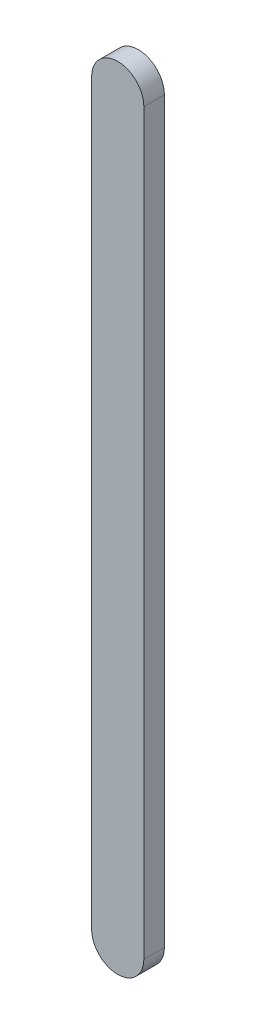
ISO-10303-21;
HEADER;
FILE_DESCRIPTION(('STEP AP214'),'2;1');
FILE_NAME('part.step','',(''),(''),'','','');
FILE_SCHEMA(('AUTOMOTIVE_DESIGN { 1 0 10303 214 1 1 1 1 }'));
ENDSEC;
DATA;
#1=APPLICATION_CONTEXT('core data for automotive mechanical design processes');
#2=APPLICATION_PROTOCOL_DEFINITION('international standard','automotive_design',2000,#1);
#3=PRODUCT_CONTEXT('',#1,'mechanical');
#4=PRODUCT('Part','Part','',(#3));
#5=PRODUCT_RELATED_PRODUCT_CATEGORY('part','',(#4));
#6=PRODUCT_DEFINITION_FORMATION('','',#4);
#7=PRODUCT_DEFINITION_CONTEXT('part definition',#1,'design');
#8=PRODUCT_DEFINITION('design','',#6,#7);
#9=PRODUCT_DEFINITION_SHAPE('','',#8);
#10=(LENGTH_UNIT() NAMED_UNIT(*) SI_UNIT(.MILLI.,.METRE.));
#11=(NAMED_UNIT(*) PLANE_ANGLE_UNIT() SI_UNIT($,.RADIAN.));
#12=(NAMED_UNIT(*) SI_UNIT($,.STERADIAN.) SOLID_ANGLE_UNIT());
#13=UNCERTAINTY_MEASURE_WITH_UNIT(LENGTH_MEASURE(1.E-05),#10,'distance_accuracy_value','');
#14=(GEOMETRIC_REPRESENTATION_CONTEXT(3) GLOBAL_UNCERTAINTY_ASSIGNED_CONTEXT((#13)) GLOBAL_UNIT_ASSIGNED_CONTEXT((#10,
#11,#12)) REPRESENTATION_CONTEXT('',''));
#15=CARTESIAN_POINT('',(0.,0.,0.));
#16=DIRECTION('',(0.,0.,1.));
#17=DIRECTION('',(1.,0.,0.));
#18=AXIS2_PLACEMENT_3D('',#15,#16,#17);
#19=CARTESIAN_POINT('',(138.5062,64.1096,0.));
#20=DIRECTION('',(-1.,0.,0.));
#21=DIRECTION('',(0.,1.,0.));
#22=AXIS2_PLACEMENT_3D('',#19,#20,#21);
#23=PLANE('',#22);
#24=DIRECTION('',(0.,1.,0.));
#25=VECTOR('',#24,1.);
#26=CARTESIAN_POINT('',(138.5062,64.1096,0.1999996));
#27=LINE('',#26,#25);
#28=CARTESIAN_POINT('',(138.5062,64.1096,0.1999996));
#29=VERTEX_POINT('',#28);
#30=CARTESIAN_POINT('',(138.5062,71.2978,0.1999996));
#31=VERTEX_POINT('',#30);
#32=EDGE_CURVE('E11',#29,#31,#27,.T.);
#33=ORIENTED_EDGE('',*,*,#32,.F.);
#34=DIRECTION('',(0.,0.,1.));
#35=VECTOR('',#34,1.);
#36=CARTESIAN_POINT('',(138.5062,64.1096,0.));
#37=LINE('',#36,#35);
#38=CARTESIAN_POINT('',(138.5062,64.1096,0.));
#39=VERTEX_POINT('',#38);
#40=EDGE_CURVE('E24',#39,#29,#37,.T.);
#41=ORIENTED_EDGE('',*,*,#40,.F.);
#42=DIRECTION('',(0.,1.,0.));
#43=VECTOR('',#42,1.);
#44=CARTESIAN_POINT('',(138.5062,64.1096,0.));
#45=LINE('',#44,#43);
#46=CARTESIAN_POINT('',(138.5062,71.2978,0.));
#47=VERTEX_POINT('',#46);
#48=EDGE_CURVE('E75',#39,#47,#45,.T.);
#49=ORIENTED_EDGE('',*,*,#48,.T.);
#50=DIRECTION('',(0.,0.,1.));
#51=VECTOR('',#50,1.);
#52=CARTESIAN_POINT('',(138.5062,71.2978,0.));
#53=LINE('',#52,#51);
#54=EDGE_CURVE('E37',#47,#31,#53,.T.);
#55=ORIENTED_EDGE('',*,*,#54,.T.);
#56=EDGE_LOOP('',(#33,#41,#49,#55));
#57=FACE_BOUND('',#56,.T.);
#58=ADVANCED_FACE('F17',(#57),#23,.F.);
#59=CARTESIAN_POINT('',(138.2522,71.2978,0.));
#60=DIRECTION('',(0.,0.,-1.));
#61=DIRECTION('',(1.,0.,0.));
#62=AXIS2_PLACEMENT_3D('',#59,#60,#61);
#63=CYLINDRICAL_SURFACE('',#62,0.254);
#64=CARTESIAN_POINT('',(138.2522,71.2978,0.1999996));
#65=DIRECTION('',(0.,0.,1.));
#66=DIRECTION('',(1.,0.,0.));
#67=AXIS2_PLACEMENT_3D('',#64,#65,#66);
#68=CIRCLE('',#67,0.254);
#69=CARTESIAN_POINT('',(137.9982,71.2978,0.1999996));
#70=VERTEX_POINT('',#69);
#71=EDGE_CURVE('E83',#31,#70,#68,.T.);
#72=ORIENTED_EDGE('',*,*,#71,.F.);
#73=ORIENTED_EDGE('',*,*,#54,.F.);
#74=CARTESIAN_POINT('',(138.2522,71.2978,0.));
#75=DIRECTION('',(0.,0.,1.));
#76=DIRECTION('',(1.,0.,0.));
#77=AXIS2_PLACEMENT_3D('',#74,#75,#76);
#78=CIRCLE('',#77,0.254);
#79=CARTESIAN_POINT('',(137.9982,71.2978,0.));
#80=VERTEX_POINT('',#79);
#81=EDGE_CURVE('E81',#47,#80,#78,.T.);
#82=ORIENTED_EDGE('',*,*,#81,.T.);
#83=DIRECTION('',(0.,0.,1.));
#84=VECTOR('',#83,1.);
#85=CARTESIAN_POINT('',(137.9982,71.2978,0.));
#86=LINE('',#85,#84);
#87=EDGE_CURVE('E67',#80,#70,#86,.T.);
#88=ORIENTED_EDGE('',*,*,#87,.T.);
#89=EDGE_LOOP('',(#72,#73,#82,#88));
#90=FACE_BOUND('',#89,.T.);
#91=ADVANCED_FACE('F89',(#90),#63,.T.);
#92=CARTESIAN_POINT('',(137.9982,71.2978,0.));
#93=DIRECTION('',(1.,0.,0.));
#94=DIRECTION('',(0.,-1.,0.));
#95=AXIS2_PLACEMENT_3D('',#92,#93,#94);
#96=PLANE('',#95);
#97=DIRECTION('',(0.,-1.,0.));
#98=VECTOR('',#97,1.);
#99=CARTESIAN_POINT('',(137.9982,71.2978,0.1999996));
#100=LINE('',#99,#98);
#101=CARTESIAN_POINT('',(137.9982,64.1096,0.1999996));
#102=VERTEX_POINT('',#101);
#103=EDGE_CURVE('E71',#70,#102,#100,.T.);
#104=ORIENTED_EDGE('',*,*,#103,.F.);
#105=ORIENTED_EDGE('',*,*,#87,.F.);
#106=DIRECTION('',(0.,-1.,0.));
#107=VECTOR('',#106,1.);
#108=CARTESIAN_POINT('',(137.9982,71.2978,0.));
#109=LINE('',#108,#107);
#110=CARTESIAN_POINT('',(137.9982,64.1096,0.));
#111=VERTEX_POINT('',#110);
#112=EDGE_CURVE('E63',#80,#111,#109,.T.);
#113=ORIENTED_EDGE('',*,*,#112,.T.);
#114=DIRECTION('',(0.,0.,1.));
#115=VECTOR('',#114,1.);
#116=CARTESIAN_POINT('',(137.9982,64.1096,0.));
#117=LINE('',#116,#115);
#118=EDGE_CURVE('E53',#111,#102,#117,.T.);
#119=ORIENTED_EDGE('',*,*,#118,.T.);
#120=EDGE_LOOP('',(#104,#105,#113,#119));
#121=FACE_BOUND('',#120,.T.);
#122=ADVANCED_FACE('F66',(#121),#96,.F.);
#123=CARTESIAN_POINT('',(138.2522,64.1096,0.));
#124=DIRECTION('',(0.,0.,-1.));
#125=DIRECTION('',(-1.,0.,0.));
#126=AXIS2_PLACEMENT_3D('',#123,#124,#125);
#127=CYLINDRICAL_SURFACE('',#126,0.254000000000003);
#128=CARTESIAN_POINT('',(138.2522,64.1096,0.1999996));
#129=DIRECTION('',(0.,0.,1.));
#130=DIRECTION('',(-1.,0.,0.));
#131=AXIS2_PLACEMENT_3D('',#128,#129,#130);
#132=CIRCLE('',#131,0.254000000000003);
#133=EDGE_CURVE('E59',#102,#29,#132,.T.);
#134=ORIENTED_EDGE('',*,*,#133,.F.);
#135=ORIENTED_EDGE('',*,*,#118,.F.);
#136=CARTESIAN_POINT('',(138.2522,64.1096,0.));
#137=DIRECTION('',(0.,0.,1.));
#138=DIRECTION('',(-1.,0.,0.));
#139=AXIS2_PLACEMENT_3D('',#136,#137,#138);
#140=CIRCLE('',#139,0.254000000000003);
#141=EDGE_CURVE('E57',#111,#39,#140,.T.);
#142=ORIENTED_EDGE('',*,*,#141,.T.);
#143=ORIENTED_EDGE('',*,*,#40,.T.);
#144=EDGE_LOOP('',(#134,#135,#142,#143));
#145=FACE_BOUND('',#144,.T.);
#146=ADVANCED_FACE('F55',(#145),#127,.T.);
#147=CARTESIAN_POINT('',(138.5062,64.1096,0.));
#148=DIRECTION('',(0.,0.,-1.));
#149=DIRECTION('',(-1.,0.,0.));
#150=AXIS2_PLACEMENT_3D('',#147,#148,#149);
#151=PLANE('',#150);
#152=ORIENTED_EDGE('',*,*,#141,.F.);
#153=ORIENTED_EDGE('',*,*,#112,.F.);
#154=ORIENTED_EDGE('',*,*,#81,.F.);
#155=ORIENTED_EDGE('',*,*,#48,.F.);
#156=EDGE_LOOP('',(#152,#153,#154,#155));
#157=FACE_BOUND('',#156,.T.);
#158=ADVANCED_FACE('F74',(#157),#151,.T.);
#159=CARTESIAN_POINT('',(138.5062,64.1096,0.1999996));
#160=DIRECTION('',(0.,0.,-1.));
#161=DIRECTION('',(-1.,0.,0.));
#162=AXIS2_PLACEMENT_3D('',#159,#160,#161);
#163=PLANE('',#162);
#164=ORIENTED_EDGE('',*,*,#32,.T.);
#165=ORIENTED_EDGE('',*,*,#71,.T.);
#166=ORIENTED_EDGE('',*,*,#103,.T.);
#167=ORIENTED_EDGE('',*,*,#133,.T.);
#168=EDGE_LOOP('',(#164,#165,#166,#167));
#169=FACE_BOUND('',#168,.T.);
#170=ADVANCED_FACE('F91',(#169),#163,.F.);
#171=CLOSED_SHELL('',(#58,#91,#122,#146,#158,#170));
#172=MANIFOLD_SOLID_BREP('B1',#171);
#173=ADVANCED_BREP_SHAPE_REPRESENTATION('',(#18,#172),#14);
#174=SHAPE_DEFINITION_REPRESENTATION(#9,#173);
ENDSEC;
END-ISO-10303-21;
